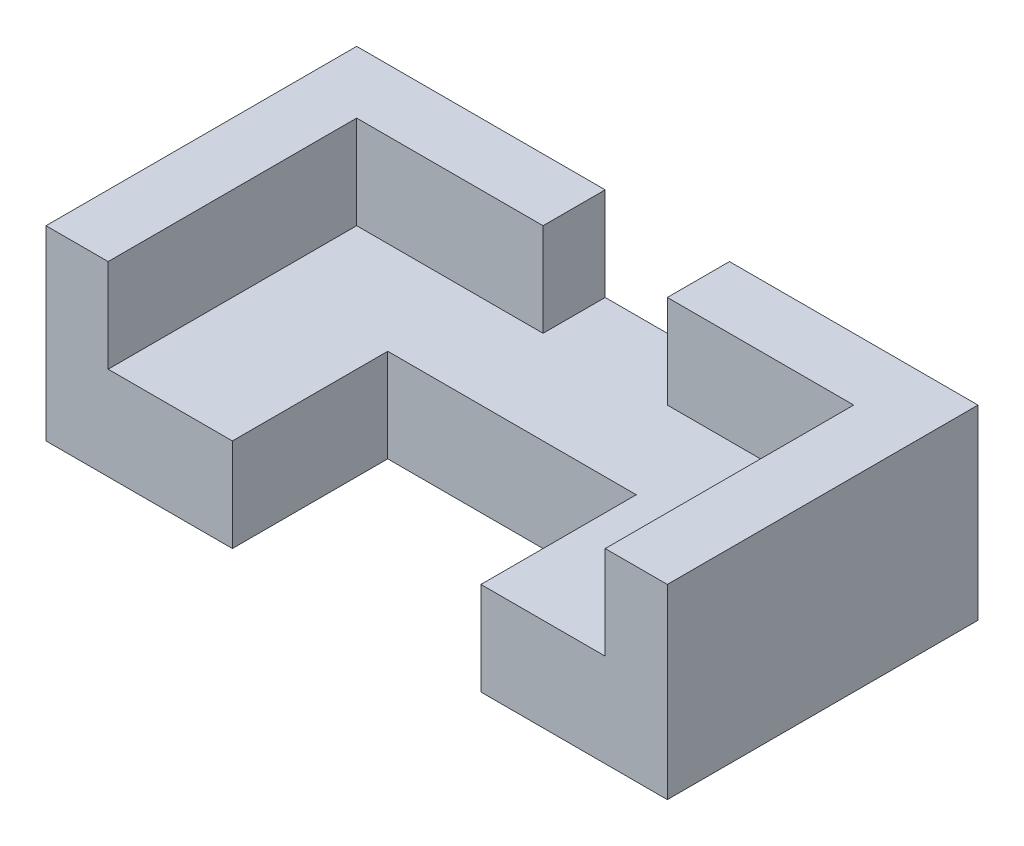
ISO-10303-21;
HEADER;
FILE_DESCRIPTION(('STEP AP214'),'2;1');
FILE_NAME('part.step','',(''),(''),'','','');
FILE_SCHEMA(('AUTOMOTIVE_DESIGN { 1 0 10303 214 1 1 1 1 }'));
ENDSEC;
DATA;
#1=APPLICATION_CONTEXT('core data for automotive mechanical design processes');
#2=APPLICATION_PROTOCOL_DEFINITION('international standard','automotive_design',2000,#1);
#3=PRODUCT_CONTEXT('',#1,'mechanical');
#4=PRODUCT('Part','Part','',(#3));
#5=PRODUCT_RELATED_PRODUCT_CATEGORY('part','',(#4));
#6=PRODUCT_DEFINITION_FORMATION('','',#4);
#7=PRODUCT_DEFINITION_CONTEXT('part definition',#1,'design');
#8=PRODUCT_DEFINITION('design','',#6,#7);
#9=PRODUCT_DEFINITION_SHAPE('','',#8);
#10=(LENGTH_UNIT() NAMED_UNIT(*) SI_UNIT(.MILLI.,.METRE.));
#11=(NAMED_UNIT(*) PLANE_ANGLE_UNIT() SI_UNIT($,.RADIAN.));
#12=(NAMED_UNIT(*) SI_UNIT($,.STERADIAN.) SOLID_ANGLE_UNIT());
#13=UNCERTAINTY_MEASURE_WITH_UNIT(LENGTH_MEASURE(1.E-05),#10,'distance_accuracy_value','');
#14=(GEOMETRIC_REPRESENTATION_CONTEXT(3) GLOBAL_UNCERTAINTY_ASSIGNED_CONTEXT((#13)) GLOBAL_UNIT_ASSIGNED_CONTEXT((#10,
#11,#12)) REPRESENTATION_CONTEXT('',''));
#15=CARTESIAN_POINT('',(0.,0.,0.));
#16=DIRECTION('',(0.,0.,1.));
#17=DIRECTION('',(1.,0.,0.));
#18=AXIS2_PLACEMENT_3D('',#15,#16,#17);
#19=CARTESIAN_POINT('',(0.,15.,50.));
#20=DIRECTION('',(0.,1.,0.));
#21=DIRECTION('',(0.,0.,1.));
#22=AXIS2_PLACEMENT_3D('',#19,#20,#21);
#23=PLANE('',#22);
#24=DIRECTION('',(1.,0.,0.));
#25=VECTOR('',#24,1.);
#26=CARTESIAN_POINT('',(0.,15.,10.));
#27=LINE('',#26,#25);
#28=CARTESIAN_POINT('',(60.,15.,10.));
#29=VERTEX_POINT('',#28);
#30=CARTESIAN_POINT('',(90.,15.,10.));
#31=VERTEX_POINT('',#30);
#32=EDGE_CURVE('E229',#29,#31,#27,.T.);
#33=ORIENTED_EDGE('',*,*,#32,.F.);
#34=DIRECTION('',(0.,0.,-1.));
#35=VECTOR('',#34,1.);
#36=CARTESIAN_POINT('',(60.,15.,10.));
#37=LINE('',#36,#35);
#38=CARTESIAN_POINT('',(60.,15.,0.));
#39=VERTEX_POINT('',#38);
#40=EDGE_CURVE('E219',#29,#39,#37,.T.);
#41=ORIENTED_EDGE('',*,*,#40,.T.);
#42=DIRECTION('',(1.,0.,0.));
#43=VECTOR('',#42,1.);
#44=CARTESIAN_POINT('',(0.,15.,0.));
#45=LINE('',#44,#43);
#46=CARTESIAN_POINT('',(40.,15.,0.));
#47=VERTEX_POINT('',#46);
#48=EDGE_CURVE('E116',#47,#39,#45,.T.);
#49=ORIENTED_EDGE('',*,*,#48,.F.);
#50=DIRECTION('',(0.,0.,-1.));
#51=VECTOR('',#50,1.);
#52=CARTESIAN_POINT('',(40.,15.,10.));
#53=LINE('',#52,#51);
#54=CARTESIAN_POINT('',(40.,15.,10.));
#55=VERTEX_POINT('',#54);
#56=EDGE_CURVE('E184',#55,#47,#53,.T.);
#57=ORIENTED_EDGE('',*,*,#56,.F.);
#58=DIRECTION('',(1.,0.,0.));
#59=VECTOR('',#58,1.);
#60=CARTESIAN_POINT('',(0.,15.,10.));
#61=LINE('',#60,#59);
#62=CARTESIAN_POINT('',(10.,15.,10.));
#63=VERTEX_POINT('',#62);
#64=EDGE_CURVE('E145',#63,#55,#61,.T.);
#65=ORIENTED_EDGE('',*,*,#64,.F.);
#66=DIRECTION('',(0.,0.,-1.));
#67=VECTOR('',#66,1.);
#68=CARTESIAN_POINT('',(10.,15.,50.));
#69=LINE('',#68,#67);
#70=CARTESIAN_POINT('',(10.,15.,50.));
#71=VERTEX_POINT('',#70);
#72=EDGE_CURVE('E43',#71,#63,#69,.T.);
#73=ORIENTED_EDGE('',*,*,#72,.F.);
#74=DIRECTION('',(1.,0.,0.));
#75=VECTOR('',#74,1.);
#76=CARTESIAN_POINT('',(0.,15.,50.));
#77=LINE('',#76,#75);
#78=CARTESIAN_POINT('',(30.,15.,50.));
#79=VERTEX_POINT('',#78);
#80=EDGE_CURVE('E142',#71,#79,#77,.T.);
#81=ORIENTED_EDGE('',*,*,#80,.T.);
#82=DIRECTION('',(0.,0.,-1.));
#83=VECTOR('',#82,1.);
#84=CARTESIAN_POINT('',(30.,15.,50.));
#85=LINE('',#84,#83);
#86=CARTESIAN_POINT('',(30.,15.,25.));
#87=VERTEX_POINT('',#86);
#88=EDGE_CURVE('E11',#79,#87,#85,.T.);
#89=ORIENTED_EDGE('',*,*,#88,.T.);
#90=DIRECTION('',(1.,0.,0.));
#91=VECTOR('',#90,1.);
#92=CARTESIAN_POINT('',(0.,15.,25.));
#93=LINE('',#92,#91);
#94=CARTESIAN_POINT('',(70.,15.,25.));
#95=VERTEX_POINT('',#94);
#96=EDGE_CURVE('E152',#87,#95,#93,.T.);
#97=ORIENTED_EDGE('',*,*,#96,.T.);
#98=DIRECTION('',(0.,0.,-1.));
#99=VECTOR('',#98,1.);
#100=CARTESIAN_POINT('',(70.,15.,50.));
#101=LINE('',#100,#99);
#102=CARTESIAN_POINT('',(70.,15.,50.));
#103=VERTEX_POINT('',#102);
#104=EDGE_CURVE('E158',#103,#95,#101,.T.);
#105=ORIENTED_EDGE('',*,*,#104,.F.);
#106=DIRECTION('',(1.,0.,0.));
#107=VECTOR('',#106,1.);
#108=CARTESIAN_POINT('',(0.,15.,50.));
#109=LINE('',#108,#107);
#110=CARTESIAN_POINT('',(90.,15.,50.));
#111=VERTEX_POINT('',#110);
#112=EDGE_CURVE('E180',#103,#111,#109,.T.);
#113=ORIENTED_EDGE('',*,*,#112,.T.);
#114=DIRECTION('',(0.,0.,-1.));
#115=VECTOR('',#114,1.);
#116=CARTESIAN_POINT('',(90.,15.,50.));
#117=LINE('',#116,#115);
#118=EDGE_CURVE('E173',#111,#31,#117,.T.);
#119=ORIENTED_EDGE('',*,*,#118,.T.);
#120=EDGE_LOOP('',(#33,#41,#49,#57,#65,#73,#81,#89,#97,#105,#113,#119));
#121=FACE_BOUND('',#120,.T.);
#122=ADVANCED_FACE('F35',(#121),#23,.T.);
#123=CARTESIAN_POINT('',(30.,0.,50.));
#124=DIRECTION('',(1.,0.,0.));
#125=DIRECTION('',(0.,1.,0.));
#126=AXIS2_PLACEMENT_3D('',#123,#124,#125);
#127=PLANE('',#126);
#128=DIRECTION('',(0.,-1.,0.));
#129=VECTOR('',#128,1.);
#130=CARTESIAN_POINT('',(30.,0.,25.));
#131=LINE('',#130,#129);
#132=CARTESIAN_POINT('',(30.,0.,25.));
#133=VERTEX_POINT('',#132);
#134=EDGE_CURVE('E50',#87,#133,#131,.T.);
#135=ORIENTED_EDGE('',*,*,#134,.F.);
#136=ORIENTED_EDGE('',*,*,#88,.F.);
#137=DIRECTION('',(0.,-1.,0.));
#138=VECTOR('',#137,1.);
#139=CARTESIAN_POINT('',(30.,0.,50.));
#140=LINE('',#139,#138);
#141=CARTESIAN_POINT('',(30.,0.,50.));
#142=VERTEX_POINT('',#141);
#143=EDGE_CURVE('E125',#79,#142,#140,.T.);
#144=ORIENTED_EDGE('',*,*,#143,.T.);
#145=DIRECTION('',(0.,0.,-1.));
#146=VECTOR('',#145,1.);
#147=CARTESIAN_POINT('',(30.,0.,50.));
#148=LINE('',#147,#146);
#149=EDGE_CURVE('E112',#142,#133,#148,.T.);
#150=ORIENTED_EDGE('',*,*,#149,.T.);
#151=EDGE_LOOP('',(#135,#136,#144,#150));
#152=FACE_BOUND('',#151,.T.);
#153=ADVANCED_FACE('F37',(#152),#127,.T.);
#154=CARTESIAN_POINT('',(10.,0.,50.));
#155=DIRECTION('',(1.,0.,0.));
#156=DIRECTION('',(0.,0.,-1.));
#157=AXIS2_PLACEMENT_3D('',#154,#155,#156);
#158=PLANE('',#157);
#159=DIRECTION('',(0.,-1.,0.));
#160=VECTOR('',#159,1.);
#161=CARTESIAN_POINT('',(10.,0.,10.));
#162=LINE('',#161,#160);
#163=CARTESIAN_POINT('',(10.,30.,10.));
#164=VERTEX_POINT('',#163);
#165=EDGE_CURVE('E135',#164,#63,#162,.T.);
#166=ORIENTED_EDGE('',*,*,#165,.F.);
#167=DIRECTION('',(0.,0.,-1.));
#168=VECTOR('',#167,1.);
#169=CARTESIAN_POINT('',(10.,30.,50.));
#170=LINE('',#169,#168);
#171=CARTESIAN_POINT('',(10.,30.,50.));
#172=VERTEX_POINT('',#171);
#173=EDGE_CURVE('E101',#172,#164,#170,.T.);
#174=ORIENTED_EDGE('',*,*,#173,.F.);
#175=DIRECTION('',(0.,-1.,0.));
#176=VECTOR('',#175,1.);
#177=CARTESIAN_POINT('',(10.,0.,50.));
#178=LINE('',#177,#176);
#179=EDGE_CURVE('E108',#172,#71,#178,.T.);
#180=ORIENTED_EDGE('',*,*,#179,.T.);
#181=ORIENTED_EDGE('',*,*,#72,.T.);
#182=EDGE_LOOP('',(#166,#174,#180,#181));
#183=FACE_BOUND('',#182,.T.);
#184=ADVANCED_FACE('F132',(#183),#158,.T.);
#185=CARTESIAN_POINT('',(0.,30.,50.));
#186=DIRECTION('',(0.,1.,0.));
#187=DIRECTION('',(0.,0.,1.));
#188=AXIS2_PLACEMENT_3D('',#185,#186,#187);
#189=PLANE('',#188);
#190=DIRECTION('',(1.,0.,0.));
#191=VECTOR('',#190,1.);
#192=CARTESIAN_POINT('',(0.,30.,0.));
#193=LINE('',#192,#191);
#194=CARTESIAN_POINT('',(0.,30.,0.));
#195=VERTEX_POINT('',#194);
#196=CARTESIAN_POINT('',(40.,30.,0.));
#197=VERTEX_POINT('',#196);
#198=EDGE_CURVE('E96',#195,#197,#193,.T.);
#199=ORIENTED_EDGE('',*,*,#198,.F.);
#200=DIRECTION('',(0.,0.,-1.));
#201=VECTOR('',#200,1.);
#202=CARTESIAN_POINT('',(0.,30.,50.));
#203=LINE('',#202,#201);
#204=CARTESIAN_POINT('',(0.,30.,50.));
#205=VERTEX_POINT('',#204);
#206=EDGE_CURVE('E89',#205,#195,#203,.T.);
#207=ORIENTED_EDGE('',*,*,#206,.F.);
#208=DIRECTION('',(1.,0.,0.));
#209=VECTOR('',#208,1.);
#210=CARTESIAN_POINT('',(0.,30.,50.));
#211=LINE('',#210,#209);
#212=EDGE_CURVE('E93',#205,#172,#211,.T.);
#213=ORIENTED_EDGE('',*,*,#212,.T.);
#214=ORIENTED_EDGE('',*,*,#173,.T.);
#215=DIRECTION('',(1.,0.,0.));
#216=VECTOR('',#215,1.);
#217=CARTESIAN_POINT('',(0.,30.,10.));
#218=LINE('',#217,#216);
#219=CARTESIAN_POINT('',(40.,30.,10.));
#220=VERTEX_POINT('',#219);
#221=EDGE_CURVE('E210',#164,#220,#218,.T.);
#222=ORIENTED_EDGE('',*,*,#221,.T.);
#223=DIRECTION('',(0.,0.,-1.));
#224=VECTOR('',#223,1.);
#225=CARTESIAN_POINT('',(40.,30.,10.));
#226=LINE('',#225,#224);
#227=EDGE_CURVE('E203',#220,#197,#226,.T.);
#228=ORIENTED_EDGE('',*,*,#227,.T.);
#229=EDGE_LOOP('',(#199,#207,#213,#214,#222,#228));
#230=FACE_BOUND('',#229,.T.);
#231=ADVANCED_FACE('F91',(#230),#189,.T.);
#232=CARTESIAN_POINT('',(0.,0.,50.));
#233=DIRECTION('',(-1.,0.,0.));
#234=DIRECTION('',(0.,0.,1.));
#235=AXIS2_PLACEMENT_3D('',#232,#233,#234);
#236=PLANE('',#235);
#237=DIRECTION('',(0.,1.,0.));
#238=VECTOR('',#237,1.);
#239=CARTESIAN_POINT('',(0.,0.,0.));
#240=LINE('',#239,#238);
#241=CARTESIAN_POINT('',(0.,0.,0.));
#242=VERTEX_POINT('',#241);
#243=EDGE_CURVE('E121',#242,#195,#240,.T.);
#244=ORIENTED_EDGE('',*,*,#243,.F.);
#245=DIRECTION('',(0.,0.,-1.));
#246=VECTOR('',#245,1.);
#247=CARTESIAN_POINT('',(0.,0.,50.));
#248=LINE('',#247,#246);
#249=CARTESIAN_POINT('',(0.,0.,50.));
#250=VERTEX_POINT('',#249);
#251=EDGE_CURVE('E73',#250,#242,#248,.T.);
#252=ORIENTED_EDGE('',*,*,#251,.F.);
#253=DIRECTION('',(0.,1.,0.));
#254=VECTOR('',#253,1.);
#255=CARTESIAN_POINT('',(0.,0.,50.));
#256=LINE('',#255,#254);
#257=EDGE_CURVE('E105',#250,#205,#256,.T.);
#258=ORIENTED_EDGE('',*,*,#257,.T.);
#259=ORIENTED_EDGE('',*,*,#206,.T.);
#260=EDGE_LOOP('',(#244,#252,#258,#259));
#261=FACE_BOUND('',#260,.T.);
#262=ADVANCED_FACE('F110',(#261),#236,.T.);
#263=CARTESIAN_POINT('',(0.,0.,50.));
#264=DIRECTION('',(0.,1.,0.));
#265=DIRECTION('',(0.,0.,1.));
#266=AXIS2_PLACEMENT_3D('',#263,#264,#265);
#267=PLANE('',#266);
#268=DIRECTION('',(1.,0.,0.));
#269=VECTOR('',#268,1.);
#270=CARTESIAN_POINT('',(0.,0.,0.));
#271=LINE('',#270,#269);
#272=CARTESIAN_POINT('',(100.,0.,0.));
#273=VERTEX_POINT('',#272);
#274=EDGE_CURVE('E123',#242,#273,#271,.T.);
#275=ORIENTED_EDGE('',*,*,#274,.T.);
#276=DIRECTION('',(0.,0.,-1.));
#277=VECTOR('',#276,1.);
#278=CARTESIAN_POINT('',(100.,0.,50.));
#279=LINE('',#278,#277);
#280=CARTESIAN_POINT('',(100.,0.,50.));
#281=VERTEX_POINT('',#280);
#282=EDGE_CURVE('E164',#281,#273,#279,.T.);
#283=ORIENTED_EDGE('',*,*,#282,.F.);
#284=DIRECTION('',(1.,0.,0.));
#285=VECTOR('',#284,1.);
#286=CARTESIAN_POINT('',(0.,0.,50.));
#287=LINE('',#286,#285);
#288=CARTESIAN_POINT('',(70.,0.,50.));
#289=VERTEX_POINT('',#288);
#290=EDGE_CURVE('E193',#289,#281,#287,.T.);
#291=ORIENTED_EDGE('',*,*,#290,.F.);
#292=DIRECTION('',(0.,0.,-1.));
#293=VECTOR('',#292,1.);
#294=CARTESIAN_POINT('',(70.,0.,50.));
#295=LINE('',#294,#293);
#296=CARTESIAN_POINT('',(70.,0.,25.));
#297=VERTEX_POINT('',#296);
#298=EDGE_CURVE('E161',#289,#297,#295,.T.);
#299=ORIENTED_EDGE('',*,*,#298,.T.);
#300=DIRECTION('',(1.,0.,0.));
#301=VECTOR('',#300,1.);
#302=CARTESIAN_POINT('',(0.,0.,25.));
#303=LINE('',#302,#301);
#304=EDGE_CURVE('E119',#133,#297,#303,.T.);
#305=ORIENTED_EDGE('',*,*,#304,.F.);
#306=ORIENTED_EDGE('',*,*,#149,.F.);
#307=DIRECTION('',(1.,0.,0.));
#308=VECTOR('',#307,1.);
#309=CARTESIAN_POINT('',(0.,0.,50.));
#310=LINE('',#309,#308);
#311=EDGE_CURVE('E58',#250,#142,#310,.T.);
#312=ORIENTED_EDGE('',*,*,#311,.F.);
#313=ORIENTED_EDGE('',*,*,#251,.T.);
#314=EDGE_LOOP('',(#275,#283,#291,#299,#305,#306,#312,#313));
#315=FACE_BOUND('',#314,.T.);
#316=ADVANCED_FACE('F276',(#315),#267,.F.);
#317=CARTESIAN_POINT('',(0.,0.,50.));
#318=DIRECTION('',(0.,0.,1.));
#319=DIRECTION('',(1.,0.,0.));
#320=AXIS2_PLACEMENT_3D('',#317,#318,#319);
#321=PLANE('',#320);
#322=ORIENTED_EDGE('',*,*,#143,.F.);
#323=ORIENTED_EDGE('',*,*,#80,.F.);
#324=ORIENTED_EDGE('',*,*,#179,.F.);
#325=ORIENTED_EDGE('',*,*,#212,.F.);
#326=ORIENTED_EDGE('',*,*,#257,.F.);
#327=ORIENTED_EDGE('',*,*,#311,.T.);
#328=EDGE_LOOP('',(#322,#323,#324,#325,#326,#327));
#329=FACE_BOUND('',#328,.T.);
#330=ADVANCED_FACE('F104',(#329),#321,.T.);
#331=CARTESIAN_POINT('',(0.,0.,0.));
#332=DIRECTION('',(0.,0.,1.));
#333=DIRECTION('',(1.,0.,0.));
#334=AXIS2_PLACEMENT_3D('',#331,#332,#333);
#335=PLANE('',#334);
#336=DIRECTION('',(0.,1.,0.));
#337=VECTOR('',#336,1.);
#338=CARTESIAN_POINT('',(40.,0.,0.));
#339=LINE('',#338,#337);
#340=EDGE_CURVE('E205',#47,#197,#339,.T.);
#341=ORIENTED_EDGE('',*,*,#340,.F.);
#342=ORIENTED_EDGE('',*,*,#48,.T.);
#343=DIRECTION('',(0.,-1.,0.));
#344=VECTOR('',#343,1.);
#345=CARTESIAN_POINT('',(60.,0.,0.));
#346=LINE('',#345,#344);
#347=CARTESIAN_POINT('',(60.,30.,0.));
#348=VERTEX_POINT('',#347);
#349=EDGE_CURVE('E223',#348,#39,#346,.T.);
#350=ORIENTED_EDGE('',*,*,#349,.F.);
#351=DIRECTION('',(1.,0.,0.));
#352=VECTOR('',#351,1.);
#353=CARTESIAN_POINT('',(0.,30.,0.));
#354=LINE('',#353,#352);
#355=CARTESIAN_POINT('',(100.,30.,0.));
#356=VERTEX_POINT('',#355);
#357=EDGE_CURVE('E177',#348,#356,#354,.T.);
#358=ORIENTED_EDGE('',*,*,#357,.T.);
#359=DIRECTION('',(0.,1.,0.));
#360=VECTOR('',#359,1.);
#361=CARTESIAN_POINT('',(100.,0.,0.));
#362=LINE('',#361,#360);
#363=EDGE_CURVE('E181',#273,#356,#362,.T.);
#364=ORIENTED_EDGE('',*,*,#363,.F.);
#365=ORIENTED_EDGE('',*,*,#274,.F.);
#366=ORIENTED_EDGE('',*,*,#243,.T.);
#367=ORIENTED_EDGE('',*,*,#198,.T.);
#368=EDGE_LOOP('',(#341,#342,#350,#358,#364,#365,#366,#367));
#369=FACE_BOUND('',#368,.T.);
#370=ADVANCED_FACE('F304',(#369),#335,.F.);
#371=CARTESIAN_POINT('',(0.,0.,25.));
#372=DIRECTION('',(0.,0.,1.));
#373=DIRECTION('',(1.,0.,0.));
#374=AXIS2_PLACEMENT_3D('',#371,#372,#373);
#375=PLANE('',#374);
#376=DIRECTION('',(0.,-1.,0.));
#377=VECTOR('',#376,1.);
#378=CARTESIAN_POINT('',(70.,0.,25.));
#379=LINE('',#378,#377);
#380=EDGE_CURVE('E155',#95,#297,#379,.T.);
#381=ORIENTED_EDGE('',*,*,#380,.F.);
#382=ORIENTED_EDGE('',*,*,#96,.F.);
#383=ORIENTED_EDGE('',*,*,#134,.T.);
#384=ORIENTED_EDGE('',*,*,#304,.T.);
#385=EDGE_LOOP('',(#381,#382,#383,#384));
#386=FACE_BOUND('',#385,.T.);
#387=ADVANCED_FACE('F275',(#386),#375,.T.);
#388=CARTESIAN_POINT('',(70.,0.,50.));
#389=DIRECTION('',(1.,0.,0.));
#390=DIRECTION('',(0.,0.,-1.));
#391=AXIS2_PLACEMENT_3D('',#388,#389,#390);
#392=PLANE('',#391);
#393=ORIENTED_EDGE('',*,*,#104,.T.);
#394=ORIENTED_EDGE('',*,*,#380,.T.);
#395=ORIENTED_EDGE('',*,*,#298,.F.);
#396=DIRECTION('',(0.,-1.,0.));
#397=VECTOR('',#396,1.);
#398=CARTESIAN_POINT('',(70.,0.,50.));
#399=LINE('',#398,#397);
#400=EDGE_CURVE('E196',#103,#289,#399,.T.);
#401=ORIENTED_EDGE('',*,*,#400,.F.);
#402=EDGE_LOOP('',(#393,#394,#395,#401));
#403=FACE_BOUND('',#402,.T.);
#404=ADVANCED_FACE('F283',(#403),#392,.F.);
#405=CARTESIAN_POINT('',(100.,0.,50.));
#406=DIRECTION('',(-1.,0.,0.));
#407=DIRECTION('',(0.,0.,1.));
#408=AXIS2_PLACEMENT_3D('',#405,#406,#407);
#409=PLANE('',#408);
#410=ORIENTED_EDGE('',*,*,#363,.T.);
#411=DIRECTION('',(0.,0.,-1.));
#412=VECTOR('',#411,1.);
#413=CARTESIAN_POINT('',(100.,30.,50.));
#414=LINE('',#413,#412);
#415=CARTESIAN_POINT('',(100.,30.,50.));
#416=VERTEX_POINT('',#415);
#417=EDGE_CURVE('E167',#416,#356,#414,.T.);
#418=ORIENTED_EDGE('',*,*,#417,.F.);
#419=DIRECTION('',(0.,1.,0.));
#420=VECTOR('',#419,1.);
#421=CARTESIAN_POINT('',(100.,0.,50.));
#422=LINE('',#421,#420);
#423=EDGE_CURVE('E190',#281,#416,#422,.T.);
#424=ORIENTED_EDGE('',*,*,#423,.F.);
#425=ORIENTED_EDGE('',*,*,#282,.T.);
#426=EDGE_LOOP('',(#410,#418,#424,#425));
#427=FACE_BOUND('',#426,.T.);
#428=ADVANCED_FACE('F293',(#427),#409,.F.);
#429=CARTESIAN_POINT('',(0.,30.,50.));
#430=DIRECTION('',(0.,1.,0.));
#431=DIRECTION('',(0.,0.,1.));
#432=AXIS2_PLACEMENT_3D('',#429,#430,#431);
#433=PLANE('',#432);
#434=ORIENTED_EDGE('',*,*,#357,.F.);
#435=DIRECTION('',(0.,0.,-1.));
#436=VECTOR('',#435,1.);
#437=CARTESIAN_POINT('',(60.,30.,10.));
#438=LINE('',#437,#436);
#439=CARTESIAN_POINT('',(60.,30.,10.));
#440=VERTEX_POINT('',#439);
#441=EDGE_CURVE('E208',#440,#348,#438,.T.);
#442=ORIENTED_EDGE('',*,*,#441,.F.);
#443=DIRECTION('',(1.,0.,0.));
#444=VECTOR('',#443,1.);
#445=CARTESIAN_POINT('',(0.,30.,10.));
#446=LINE('',#445,#444);
#447=CARTESIAN_POINT('',(90.,30.,10.));
#448=VERTEX_POINT('',#447);
#449=EDGE_CURVE('E226',#440,#448,#446,.T.);
#450=ORIENTED_EDGE('',*,*,#449,.T.);
#451=DIRECTION('',(0.,0.,-1.));
#452=VECTOR('',#451,1.);
#453=CARTESIAN_POINT('',(90.,30.,50.));
#454=LINE('',#453,#452);
#455=CARTESIAN_POINT('',(90.,30.,50.));
#456=VERTEX_POINT('',#455);
#457=EDGE_CURVE('E170',#456,#448,#454,.T.);
#458=ORIENTED_EDGE('',*,*,#457,.F.);
#459=DIRECTION('',(1.,0.,0.));
#460=VECTOR('',#459,1.);
#461=CARTESIAN_POINT('',(0.,30.,50.));
#462=LINE('',#461,#460);
#463=EDGE_CURVE('E187',#456,#416,#462,.T.);
#464=ORIENTED_EDGE('',*,*,#463,.T.);
#465=ORIENTED_EDGE('',*,*,#417,.T.);
#466=EDGE_LOOP('',(#434,#442,#450,#458,#464,#465));
#467=FACE_BOUND('',#466,.T.);
#468=ADVANCED_FACE('F242',(#467),#433,.T.);
#469=CARTESIAN_POINT('',(90.,0.,50.));
#470=DIRECTION('',(-1.,0.,0.));
#471=DIRECTION('',(0.,0.,1.));
#472=AXIS2_PLACEMENT_3D('',#469,#470,#471);
#473=PLANE('',#472);
#474=DIRECTION('',(0.,1.,0.));
#475=VECTOR('',#474,1.);
#476=CARTESIAN_POINT('',(90.,0.,10.));
#477=LINE('',#476,#475);
#478=EDGE_CURVE('E222',#31,#448,#477,.T.);
#479=ORIENTED_EDGE('',*,*,#478,.F.);
#480=ORIENTED_EDGE('',*,*,#118,.F.);
#481=DIRECTION('',(0.,1.,0.));
#482=VECTOR('',#481,1.);
#483=CARTESIAN_POINT('',(90.,0.,50.));
#484=LINE('',#483,#482);
#485=EDGE_CURVE('E176',#111,#456,#484,.T.);
#486=ORIENTED_EDGE('',*,*,#485,.T.);
#487=ORIENTED_EDGE('',*,*,#457,.T.);
#488=EDGE_LOOP('',(#479,#480,#486,#487));
#489=FACE_BOUND('',#488,.T.);
#490=ADVANCED_FACE('F253',(#489),#473,.T.);
#491=CARTESIAN_POINT('',(0.,0.,50.));
#492=DIRECTION('',(0.,0.,1.));
#493=DIRECTION('',(1.,0.,0.));
#494=AXIS2_PLACEMENT_3D('',#491,#492,#493);
#495=PLANE('',#494);
#496=ORIENTED_EDGE('',*,*,#112,.F.);
#497=ORIENTED_EDGE('',*,*,#400,.T.);
#498=ORIENTED_EDGE('',*,*,#290,.T.);
#499=ORIENTED_EDGE('',*,*,#423,.T.);
#500=ORIENTED_EDGE('',*,*,#463,.F.);
#501=ORIENTED_EDGE('',*,*,#485,.F.);
#502=EDGE_LOOP('',(#496,#497,#498,#499,#500,#501));
#503=FACE_BOUND('',#502,.T.);
#504=ADVANCED_FACE('F261',(#503),#495,.T.);
#505=CARTESIAN_POINT('',(40.,0.,10.));
#506=DIRECTION('',(-1.,0.,0.));
#507=DIRECTION('',(0.,0.,1.));
#508=AXIS2_PLACEMENT_3D('',#505,#506,#507);
#509=PLANE('',#508);
#510=ORIENTED_EDGE('',*,*,#340,.T.);
#511=ORIENTED_EDGE('',*,*,#227,.F.);
#512=DIRECTION('',(0.,1.,0.));
#513=VECTOR('',#512,1.);
#514=CARTESIAN_POINT('',(40.,0.,10.));
#515=LINE('',#514,#513);
#516=EDGE_CURVE('E213',#55,#220,#515,.T.);
#517=ORIENTED_EDGE('',*,*,#516,.F.);
#518=ORIENTED_EDGE('',*,*,#56,.T.);
#519=EDGE_LOOP('',(#510,#511,#517,#518));
#520=FACE_BOUND('',#519,.T.);
#521=ADVANCED_FACE('F357',(#520),#509,.F.);
#522=CARTESIAN_POINT('',(0.,0.,10.));
#523=DIRECTION('',(0.,0.,1.));
#524=DIRECTION('',(1.,0.,0.));
#525=AXIS2_PLACEMENT_3D('',#522,#523,#524);
#526=PLANE('',#525);
#527=ORIENTED_EDGE('',*,*,#64,.T.);
#528=ORIENTED_EDGE('',*,*,#516,.T.);
#529=ORIENTED_EDGE('',*,*,#221,.F.);
#530=ORIENTED_EDGE('',*,*,#165,.T.);
#531=EDGE_LOOP('',(#527,#528,#529,#530));
#532=FACE_BOUND('',#531,.T.);
#533=ADVANCED_FACE('F326',(#532),#526,.T.);
#534=CARTESIAN_POINT('',(60.,0.,10.));
#535=DIRECTION('',(1.,0.,0.));
#536=DIRECTION('',(0.,0.,-1.));
#537=AXIS2_PLACEMENT_3D('',#534,#535,#536);
#538=PLANE('',#537);
#539=ORIENTED_EDGE('',*,*,#349,.T.);
#540=ORIENTED_EDGE('',*,*,#40,.F.);
#541=DIRECTION('',(0.,-1.,0.));
#542=VECTOR('',#541,1.);
#543=CARTESIAN_POINT('',(60.,0.,10.));
#544=LINE('',#543,#542);
#545=EDGE_CURVE('E232',#440,#29,#544,.T.);
#546=ORIENTED_EDGE('',*,*,#545,.F.);
#547=ORIENTED_EDGE('',*,*,#441,.T.);
#548=EDGE_LOOP('',(#539,#540,#546,#547));
#549=FACE_BOUND('',#548,.T.);
#550=ADVANCED_FACE('F301',(#549),#538,.F.);
#551=CARTESIAN_POINT('',(0.,0.,10.));
#552=DIRECTION('',(0.,0.,1.));
#553=DIRECTION('',(1.,0.,0.));
#554=AXIS2_PLACEMENT_3D('',#551,#552,#553);
#555=PLANE('',#554);
#556=ORIENTED_EDGE('',*,*,#449,.F.);
#557=ORIENTED_EDGE('',*,*,#545,.T.);
#558=ORIENTED_EDGE('',*,*,#32,.T.);
#559=ORIENTED_EDGE('',*,*,#478,.T.);
#560=EDGE_LOOP('',(#556,#557,#558,#559));
#561=FACE_BOUND('',#560,.T.);
#562=ADVANCED_FACE('F320',(#561),#555,.T.);
#563=CLOSED_SHELL('',(#122,#153,#184,#231,#262,#316,#330,#370,#387,#404,#428,#468,#490,#504,
#521,#533,#550,#562));
#564=MANIFOLD_SOLID_BREP('B2',#563);
#565=ADVANCED_BREP_SHAPE_REPRESENTATION('',(#18,#564),#14);
#566=SHAPE_DEFINITION_REPRESENTATION(#9,#565);
ENDSEC;
END-ISO-10303-21;
